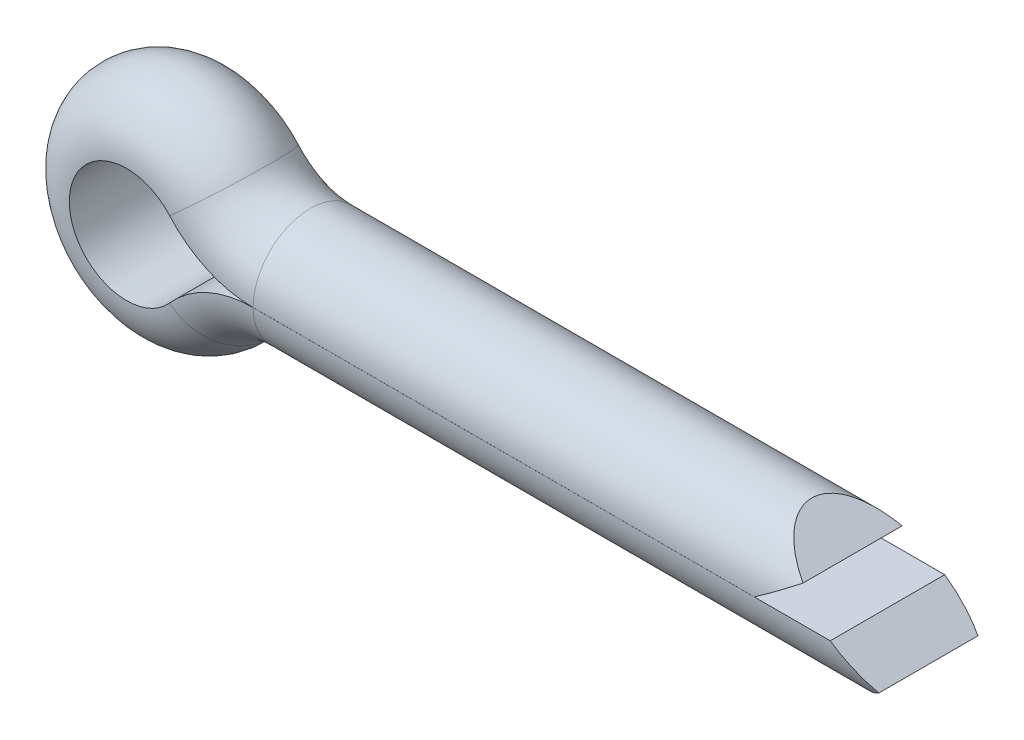
ISO-10303-21;
HEADER;
FILE_DESCRIPTION(('STEP AP214'),'2;1');
FILE_NAME('part.step','',(''),(''),'','','');
FILE_SCHEMA(('AUTOMOTIVE_DESIGN { 1 0 10303 214 1 1 1 1 }'));
ENDSEC;
DATA;
#1=APPLICATION_CONTEXT('core data for automotive mechanical design processes');
#2=APPLICATION_PROTOCOL_DEFINITION('international standard','automotive_design',2000,#1);
#3=PRODUCT_CONTEXT('',#1,'mechanical');
#4=PRODUCT('Part','Part','',(#3));
#5=PRODUCT_RELATED_PRODUCT_CATEGORY('part','',(#4));
#6=PRODUCT_DEFINITION_FORMATION('','',#4);
#7=PRODUCT_DEFINITION_CONTEXT('part definition',#1,'design');
#8=PRODUCT_DEFINITION('design','',#6,#7);
#9=PRODUCT_DEFINITION_SHAPE('','',#8);
#10=(LENGTH_UNIT() NAMED_UNIT(*) SI_UNIT(.MILLI.,.METRE.));
#11=(NAMED_UNIT(*) PLANE_ANGLE_UNIT() SI_UNIT($,.RADIAN.));
#12=(NAMED_UNIT(*) SI_UNIT($,.STERADIAN.) SOLID_ANGLE_UNIT());
#13=UNCERTAINTY_MEASURE_WITH_UNIT(LENGTH_MEASURE(1.E-05),#10,'distance_accuracy_value','');
#14=(GEOMETRIC_REPRESENTATION_CONTEXT(3) GLOBAL_UNCERTAINTY_ASSIGNED_CONTEXT((#13)) GLOBAL_UNIT_ASSIGNED_CONTEXT((#10,
#11,#12)) REPRESENTATION_CONTEXT('',''));
#15=CARTESIAN_POINT('',(0.,0.,0.));
#16=DIRECTION('',(0.,0.,1.));
#17=DIRECTION('',(1.,0.,0.));
#18=AXIS2_PLACEMENT_3D('',#15,#16,#17);
#19=CARTESIAN_POINT('',(0.,-0.00199999999999983,4.74999957894735));
#20=DIRECTION('',(0.,-1.,0.));
#21=DIRECTION('',(0.,0.,-1.));
#22=AXIS2_PLACEMENT_3D('',#19,#20,#21);
#23=PLANE('',#22);
#24=DIRECTION('',(1.,0.,0.));
#25=VECTOR('',#24,1.);
#26=CARTESIAN_POINT('',(0.,-0.00199999999999983,4.74999957894735));
#27=LINE('',#26,#25);
#28=CARTESIAN_POINT('',(0.,-0.00199999999999983,4.74999957894735));
#29=VERTEX_POINT('',#28);
#30=CARTESIAN_POINT('',(47.9010703759948,-0.00199999999999983,4.74999957894735));
#31=VERTEX_POINT('',#30);
#32=EDGE_CURVE('E39',#29,#31,#27,.T.);
#33=ORIENTED_EDGE('',*,*,#32,.T.);
#34=DIRECTION('',(0.,0.,-1.));
#35=VECTOR('',#34,1.);
#36=CARTESIAN_POINT('',(47.9010703759948,-0.00199999999999983,4.74999957894735));
#37=LINE('',#36,#35);
#38=CARTESIAN_POINT('',(47.9010703759948,-0.00199999999999983,-4.74999957894735));
#39=VERTEX_POINT('',#38);
#40=EDGE_CURVE('E95',#31,#39,#37,.T.);
#41=ORIENTED_EDGE('',*,*,#40,.T.);
#42=DIRECTION('',(1.,0.,0.));
#43=VECTOR('',#42,1.);
#44=CARTESIAN_POINT('',(0.,-0.00199999999999983,-4.74999957894735));
#45=LINE('',#44,#43);
#46=CARTESIAN_POINT('',(0.,-0.00199999999999983,-4.74999957894735));
#47=VERTEX_POINT('',#46);
#48=EDGE_CURVE('E11',#47,#39,#45,.T.);
#49=ORIENTED_EDGE('',*,*,#48,.F.);
#50=DIRECTION('',(0.,0.,-1.));
#51=VECTOR('',#50,1.);
#52=CARTESIAN_POINT('',(0.,-0.00199999999999983,4.74999957894735));
#53=LINE('',#52,#51);
#54=EDGE_CURVE('E112',#29,#47,#53,.T.);
#55=ORIENTED_EDGE('',*,*,#54,.F.);
#56=EDGE_LOOP('',(#33,#41,#49,#55));
#57=FACE_BOUND('',#56,.T.);
#58=ADVANCED_FACE('F32',(#57),#23,.F.);
#59=CARTESIAN_POINT('',(0.,0.,0.));
#60=DIRECTION('',(1.,0.,0.));
#61=DIRECTION('',(0.,0.,-1.));
#62=AXIS2_PLACEMENT_3D('',#59,#60,#61);
#63=CYLINDRICAL_SURFACE('',#62,4.75);
#64=CARTESIAN_POINT('',(54.6847948103704,0.,0.));
#65=DIRECTION('',(-0.574540032520499,0.818476481660496,0.));
#66=DIRECTION('',(0.818476481660496,0.574540032520499,0.));
#67=AXIS2_PLACEMENT_3D('',#64,#65,#66);
#68=ELLIPSE('',#67,8.26748308409741,4.75);
#69=CARTESIAN_POINT('',(51.3000000000001,-2.37599999999998,-4.11304315562092));
#70=VERTEX_POINT('',#69);
#71=CARTESIAN_POINT('',(51.3000000000001,-2.376,4.11304315562092));
#72=VERTEX_POINT('',#71);
#73=EDGE_CURVE('E109',#70,#72,#68,.T.);
#74=ORIENTED_EDGE('',*,*,#73,.T.);
#75=CARTESIAN_POINT('',(47.8982069138011,0.,0.));
#76=DIRECTION('',(-0.572612045834188,-0.819826472471819,0.));
#77=DIRECTION('',(0.819826472471819,-0.572612045834188,0.));
#78=AXIS2_PLACEMENT_3D('',#75,#76,#77);
#79=ELLIPSE('',#78,8.29531972747822,4.75);
#80=EDGE_CURVE('E98',#72,#31,#79,.T.);
#81=ORIENTED_EDGE('',*,*,#80,.T.);
#82=ORIENTED_EDGE('',*,*,#32,.F.);
#83=CARTESIAN_POINT('',(0.,0.,0.));
#84=DIRECTION('',(-1.,0.,0.));
#85=DIRECTION('',(0.,0.,-1.));
#86=AXIS2_PLACEMENT_3D('',#83,#84,#85);
#87=CIRCLE('',#86,4.75);
#88=EDGE_CURVE('E122',#47,#29,#87,.T.);
#89=ORIENTED_EDGE('',*,*,#88,.F.);
#90=ORIENTED_EDGE('',*,*,#48,.T.);
#91=EDGE_CURVE('E100',#39,#70,#79,.T.);
#92=ORIENTED_EDGE('',*,*,#91,.T.);
#93=EDGE_LOOP('',(#74,#81,#82,#89,#90,#92));
#94=FACE_BOUND('',#93,.T.);
#95=ADVANCED_FACE('F106',(#94),#63,.T.);
#96=CARTESIAN_POINT('',(0.,-9.23026315789474,0.));
#97=DIRECTION('',(0.,0.,-1.));
#98=DIRECTION('',(-1.,0.,0.));
#99=AXIS2_PLACEMENT_3D('',#96,#97,#98);
#100=CYLINDRICAL_SURFACE('',#99,9.22826315789474);
#101=DIRECTION('',(0.,0.,-1.));
#102=VECTOR('',#101,1.);
#103=CARTESIAN_POINT('',(-6.93096847058819,-3.13743811764701,4.74999957894735));
#104=LINE('',#103,#102);
#105=CARTESIAN_POINT('',(-6.93096847058819,-3.13743811764701,4.74999957894735));
#106=VERTEX_POINT('',#105);
#107=CARTESIAN_POINT('',(-6.93096847058819,-3.13743811764701,-4.74999957894735));
#108=VERTEX_POINT('',#107);
#109=EDGE_CURVE('E130',#106,#108,#104,.T.);
#110=ORIENTED_EDGE('',*,*,#109,.F.);
#111=CARTESIAN_POINT('',(0.,-9.23026315789474,4.74999957894735));
#112=DIRECTION('',(0.,0.,-1.));
#113=DIRECTION('',(-1.,0.,0.));
#114=AXIS2_PLACEMENT_3D('',#111,#112,#113);
#115=CIRCLE('',#114,9.22826315789474);
#116=EDGE_CURVE('E116',#106,#29,#115,.T.);
#117=ORIENTED_EDGE('',*,*,#116,.T.);
#118=ORIENTED_EDGE('',*,*,#54,.T.);
#119=CARTESIAN_POINT('',(0.,-9.23026315789474,-4.74999957894735));
#120=DIRECTION('',(0.,0.,-1.));
#121=DIRECTION('',(-1.,0.,0.));
#122=AXIS2_PLACEMENT_3D('',#119,#120,#121);
#123=CIRCLE('',#122,9.22826315789474);
#124=EDGE_CURVE('E114',#108,#47,#123,.T.);
#125=ORIENTED_EDGE('',*,*,#124,.F.);
#126=EDGE_LOOP('',(#110,#117,#118,#125));
#127=FACE_BOUND('',#126,.T.);
#128=ADVANCED_FACE('F195',(#127),#100,.T.);
#129=CARTESIAN_POINT('',(0.,-9.23026315789474,0.));
#130=DIRECTION('',(0.,0.,-1.));
#131=DIRECTION('',(-1.,0.,0.));
#132=AXIS2_PLACEMENT_3D('',#129,#130,#131);
#133=TOROIDAL_SURFACE('',#132,9.23026315789474,4.75);
#134=CARTESIAN_POINT('',(-6.93247058823525,-3.13611764705878,0.));
#135=DIRECTION('',(-0.660235294117636,-0.751058823529421,0.));
#136=DIRECTION('',(0.,0.,-1.));
#137=AXIS2_PLACEMENT_3D('',#134,#135,#136);
#138=CIRCLE('',#137,4.75);
#139=EDGE_CURVE('E133',#108,#106,#138,.T.);
#140=ORIENTED_EDGE('',*,*,#139,.F.);
#141=ORIENTED_EDGE('',*,*,#124,.T.);
#142=ORIENTED_EDGE('',*,*,#88,.T.);
#143=ORIENTED_EDGE('',*,*,#116,.F.);
#144=EDGE_LOOP('',(#140,#141,#142,#143));
#145=FACE_BOUND('',#144,.T.);
#146=ADVANCED_FACE('F197',(#145),#133,.T.);
#147=CARTESIAN_POINT('',(-10.5,0.,0.));
#148=DIRECTION('',(0.,0.,1.));
#149=DIRECTION('',(1.,0.,0.));
#150=AXIS2_PLACEMENT_3D('',#147,#148,#149);
#151=CYLINDRICAL_SURFACE('',#150,4.752);
#152=DIRECTION('',(0.,0.,-1.));
#153=VECTOR('',#152,1.);
#154=CARTESIAN_POINT('',(-6.93096847058824,3.13743811764706,4.74999957894735));
#155=LINE('',#154,#153);
#156=CARTESIAN_POINT('',(-6.93096847058824,3.13743811764706,4.74999957894735));
#157=VERTEX_POINT('',#156);
#158=CARTESIAN_POINT('',(-6.93096847058824,3.13743811764706,-4.74999957894735));
#159=VERTEX_POINT('',#158);
#160=EDGE_CURVE('E142',#157,#159,#155,.T.);
#161=ORIENTED_EDGE('',*,*,#160,.F.);
#162=CARTESIAN_POINT('',(-10.5,0.,4.74999957894735));
#163=DIRECTION('',(0.,0.,1.));
#164=DIRECTION('',(1.,0.,0.));
#165=AXIS2_PLACEMENT_3D('',#162,#163,#164);
#166=CIRCLE('',#165,4.752);
#167=EDGE_CURVE('E127',#157,#106,#166,.T.);
#168=ORIENTED_EDGE('',*,*,#167,.T.);
#169=ORIENTED_EDGE('',*,*,#109,.T.);
#170=CARTESIAN_POINT('',(-10.5,0.,-4.74999957894735));
#171=DIRECTION('',(0.,0.,1.));
#172=DIRECTION('',(1.,0.,0.));
#173=AXIS2_PLACEMENT_3D('',#170,#171,#172);
#174=CIRCLE('',#173,4.752);
#175=EDGE_CURVE('E124',#159,#108,#174,.T.);
#176=ORIENTED_EDGE('',*,*,#175,.F.);
#177=EDGE_LOOP('',(#161,#168,#169,#176));
#178=FACE_BOUND('',#177,.T.);
#179=ADVANCED_FACE('F192',(#178),#151,.F.);
#180=CARTESIAN_POINT('',(-10.5,0.,0.));
#181=DIRECTION('',(0.,0.,1.));
#182=DIRECTION('',(1.,0.,0.));
#183=AXIS2_PLACEMENT_3D('',#180,#181,#182);
#184=DEGENERATE_TOROIDAL_SURFACE('',#183,4.75,4.75,.T.);
#185=CARTESIAN_POINT('',(-6.93247058823529,3.13611764705882,0.));
#186=DIRECTION('',(0.660235294117647,-0.751058823529412,0.));
#187=DIRECTION('',(0.,0.,-1.));
#188=AXIS2_PLACEMENT_3D('',#185,#186,#187);
#189=CIRCLE('',#188,4.75);
#190=EDGE_CURVE('E145',#159,#157,#189,.T.);
#191=ORIENTED_EDGE('',*,*,#190,.F.);
#192=ORIENTED_EDGE('',*,*,#175,.T.);
#193=ORIENTED_EDGE('',*,*,#139,.T.);
#194=ORIENTED_EDGE('',*,*,#167,.F.);
#195=EDGE_LOOP('',(#191,#192,#193,#194));
#196=FACE_BOUND('',#195,.T.);
#197=ADVANCED_FACE('F189',(#196),#184,.T.);
#198=CARTESIAN_POINT('',(0.,9.23026315789474,0.));
#199=DIRECTION('',(0.,0.,-1.));
#200=DIRECTION('',(-1.,0.,0.));
#201=AXIS2_PLACEMENT_3D('',#198,#199,#200);
#202=CYLINDRICAL_SURFACE('',#201,9.22826315789474);
#203=DIRECTION('',(0.,0.,-1.));
#204=VECTOR('',#203,1.);
#205=CARTESIAN_POINT('',(0.,0.002,4.74999957894735));
#206=LINE('',#205,#204);
#207=CARTESIAN_POINT('',(0.,0.002,4.74999957894735));
#208=VERTEX_POINT('',#207);
#209=CARTESIAN_POINT('',(0.,0.002,-4.74999957894735));
#210=VERTEX_POINT('',#209);
#211=EDGE_CURVE('E152',#208,#210,#206,.T.);
#212=ORIENTED_EDGE('',*,*,#211,.F.);
#213=CARTESIAN_POINT('',(0.,9.23026315789474,4.74999957894735));
#214=DIRECTION('',(0.,0.,-1.));
#215=DIRECTION('',(-1.,0.,0.));
#216=AXIS2_PLACEMENT_3D('',#213,#214,#215);
#217=CIRCLE('',#216,9.22826315789474);
#218=EDGE_CURVE('E139',#208,#157,#217,.T.);
#219=ORIENTED_EDGE('',*,*,#218,.T.);
#220=ORIENTED_EDGE('',*,*,#160,.T.);
#221=CARTESIAN_POINT('',(0.,9.23026315789474,-4.74999957894735));
#222=DIRECTION('',(0.,0.,-1.));
#223=DIRECTION('',(-1.,0.,0.));
#224=AXIS2_PLACEMENT_3D('',#221,#222,#223);
#225=CIRCLE('',#224,9.22826315789474);
#226=EDGE_CURVE('E136',#210,#159,#225,.T.);
#227=ORIENTED_EDGE('',*,*,#226,.F.);
#228=EDGE_LOOP('',(#212,#219,#220,#227));
#229=FACE_BOUND('',#228,.T.);
#230=ADVANCED_FACE('F183',(#229),#202,.T.);
#231=CARTESIAN_POINT('',(0.,9.23026315789474,0.));
#232=DIRECTION('',(0.,0.,-1.));
#233=DIRECTION('',(-1.,0.,0.));
#234=AXIS2_PLACEMENT_3D('',#231,#232,#233);
#235=TOROIDAL_SURFACE('',#234,9.23026315789474,4.75);
#236=CARTESIAN_POINT('',(0.,0.,0.));
#237=DIRECTION('',(1.,0.,0.));
#238=DIRECTION('',(0.,0.,-1.));
#239=AXIS2_PLACEMENT_3D('',#236,#237,#238);
#240=CIRCLE('',#239,4.75);
#241=EDGE_CURVE('E157',#210,#208,#240,.T.);
#242=ORIENTED_EDGE('',*,*,#241,.F.);
#243=ORIENTED_EDGE('',*,*,#226,.T.);
#244=ORIENTED_EDGE('',*,*,#190,.T.);
#245=ORIENTED_EDGE('',*,*,#218,.F.);
#246=EDGE_LOOP('',(#242,#243,#244,#245));
#247=FACE_BOUND('',#246,.T.);
#248=ADVANCED_FACE('F186',(#247),#235,.T.);
#249=CARTESIAN_POINT('',(0.,0.,0.));
#250=DIRECTION('',(1.,0.,0.));
#251=DIRECTION('',(0.,0.,-1.));
#252=AXIS2_PLACEMENT_3D('',#249,#250,#251);
#253=CYLINDRICAL_SURFACE('',#252,4.75);
#254=CARTESIAN_POINT('',(41.598206913801,0.,0.));
#255=DIRECTION('',(-0.572612045834189,0.819826472471818,0.));
#256=DIRECTION('',(0.819826472471818,0.572612045834189,0.));
#257=AXIS2_PLACEMENT_3D('',#254,#255,#256);
#258=ELLIPSE('',#257,8.2953197274782,4.75);
#259=CARTESIAN_POINT('',(45.,2.376,4.11304315562091));
#260=VERTEX_POINT('',#259);
#261=CARTESIAN_POINT('',(41.6010703759947,0.002,4.74999957894735));
#262=VERTEX_POINT('',#261);
#263=EDGE_CURVE('E46',#260,#262,#258,.F.);
#264=ORIENTED_EDGE('',*,*,#263,.F.);
#265=CARTESIAN_POINT('',(48.3847948103702,0.,0.));
#266=DIRECTION('',(-0.574540032520499,-0.818476481660495,0.));
#267=DIRECTION('',(0.818476481660496,-0.574540032520499,0.));
#268=AXIS2_PLACEMENT_3D('',#265,#266,#267);
#269=ELLIPSE('',#268,8.2674830840974,4.75);
#270=CARTESIAN_POINT('',(45.,2.376,-4.11304315562091));
#271=VERTEX_POINT('',#270);
#272=EDGE_CURVE('E165',#271,#260,#269,.F.);
#273=ORIENTED_EDGE('',*,*,#272,.F.);
#274=CARTESIAN_POINT('',(41.6010703759947,0.00200000000000035,-4.74999957894735));
#275=VERTEX_POINT('',#274);
#276=EDGE_CURVE('E161',#275,#271,#258,.F.);
#277=ORIENTED_EDGE('',*,*,#276,.F.);
#278=DIRECTION('',(1.,0.,0.));
#279=VECTOR('',#278,1.);
#280=CARTESIAN_POINT('',(0.,0.002,-4.74999957894735));
#281=LINE('',#280,#279);
#282=EDGE_CURVE('E148',#210,#275,#281,.T.);
#283=ORIENTED_EDGE('',*,*,#282,.F.);
#284=ORIENTED_EDGE('',*,*,#241,.T.);
#285=DIRECTION('',(1.,0.,0.));
#286=VECTOR('',#285,1.);
#287=CARTESIAN_POINT('',(0.,0.002,4.74999957894735));
#288=LINE('',#287,#286);
#289=EDGE_CURVE('E149',#208,#262,#288,.T.);
#290=ORIENTED_EDGE('',*,*,#289,.T.);
#291=EDGE_LOOP('',(#264,#273,#277,#283,#284,#290));
#292=FACE_BOUND('',#291,.T.);
#293=ADVANCED_FACE('F175',(#292),#253,.T.);
#294=CARTESIAN_POINT('',(0.,0.002,4.74999957894735));
#295=DIRECTION('',(0.,-1.,0.));
#296=DIRECTION('',(0.,0.,-1.));
#297=AXIS2_PLACEMENT_3D('',#294,#295,#296);
#298=PLANE('',#297);
#299=DIRECTION('',(0.,0.,-1.));
#300=VECTOR('',#299,1.);
#301=CARTESIAN_POINT('',(41.6010703759947,0.002,4.74999957894735));
#302=LINE('',#301,#300);
#303=EDGE_CURVE('E163',#262,#275,#302,.T.);
#304=ORIENTED_EDGE('',*,*,#303,.F.);
#305=ORIENTED_EDGE('',*,*,#289,.F.);
#306=ORIENTED_EDGE('',*,*,#211,.T.);
#307=ORIENTED_EDGE('',*,*,#282,.T.);
#308=EDGE_LOOP('',(#304,#305,#306,#307));
#309=FACE_BOUND('',#308,.T.);
#310=ADVANCED_FACE('F180',(#309),#298,.T.);
#311=CARTESIAN_POINT('',(45.,2.376,-4.74999957894735));
#312=DIRECTION('',(-0.572612045834189,0.819826472471818,0.));
#313=DIRECTION('',(-0.819826472471818,-0.572612045834189,0.));
#314=AXIS2_PLACEMENT_3D('',#311,#312,#313);
#315=PLANE('',#314);
#316=ORIENTED_EDGE('',*,*,#263,.T.);
#317=ORIENTED_EDGE('',*,*,#303,.T.);
#318=ORIENTED_EDGE('',*,*,#276,.T.);
#319=DIRECTION('',(0.,0.,1.));
#320=VECTOR('',#319,1.);
#321=CARTESIAN_POINT('',(45.,2.376,-4.74999957894735));
#322=LINE('',#321,#320);
#323=EDGE_CURVE('E167',#271,#260,#322,.T.);
#324=ORIENTED_EDGE('',*,*,#323,.T.);
#325=EDGE_LOOP('',(#316,#317,#318,#324));
#326=FACE_BOUND('',#325,.T.);
#327=ADVANCED_FACE('F170',(#326),#315,.F.);
#328=CARTESIAN_POINT('',(45.,2.376,-4.74999957894735));
#329=DIRECTION('',(-0.574540032520499,-0.818476481660495,0.));
#330=DIRECTION('',(0.818476481660495,-0.574540032520499,0.));
#331=AXIS2_PLACEMENT_3D('',#328,#329,#330);
#332=PLANE('',#331);
#333=ORIENTED_EDGE('',*,*,#272,.T.);
#334=ORIENTED_EDGE('',*,*,#323,.F.);
#335=EDGE_LOOP('',(#333,#334));
#336=FACE_BOUND('',#335,.T.);
#337=ADVANCED_FACE('F276',(#336),#332,.F.);
#338=CARTESIAN_POINT('',(51.3000000000001,-2.376,-4.74999957894735));
#339=DIRECTION('',(-0.574540032520499,0.818476481660496,0.));
#340=DIRECTION('',(-0.818476481660496,-0.574540032520499,0.));
#341=AXIS2_PLACEMENT_3D('',#338,#339,#340);
#342=PLANE('',#341);
#343=DIRECTION('',(0.,0.,1.));
#344=VECTOR('',#343,1.);
#345=CARTESIAN_POINT('',(51.3000000000001,-2.376,-4.74999957894735));
#346=LINE('',#345,#344);
#347=EDGE_CURVE('E54',#70,#72,#346,.T.);
#348=ORIENTED_EDGE('',*,*,#347,.T.);
#349=ORIENTED_EDGE('',*,*,#73,.F.);
#350=EDGE_LOOP('',(#348,#349));
#351=FACE_BOUND('',#350,.T.);
#352=ADVANCED_FACE('F283',(#351),#342,.F.);
#353=CARTESIAN_POINT('',(51.3000000000001,-2.376,-4.74999957894735));
#354=DIRECTION('',(-0.572612045834188,-0.819826472471819,0.));
#355=DIRECTION('',(0.819826472471819,-0.572612045834188,0.));
#356=AXIS2_PLACEMENT_3D('',#353,#354,#355);
#357=PLANE('',#356);
#358=ORIENTED_EDGE('',*,*,#347,.F.);
#359=ORIENTED_EDGE('',*,*,#91,.F.);
#360=ORIENTED_EDGE('',*,*,#40,.F.);
#361=ORIENTED_EDGE('',*,*,#80,.F.);
#362=EDGE_LOOP('',(#358,#359,#360,#361));
#363=FACE_BOUND('',#362,.T.);
#364=ADVANCED_FACE('F97',(#363),#357,.F.);
#365=CLOSED_SHELL('',(#58,#95,#128,#146,#179,#197,#230,#248,#293,#310,#327,#337,#352,#364));
#366=MANIFOLD_SOLID_BREP('B2',#365);
#367=ADVANCED_BREP_SHAPE_REPRESENTATION('',(#18,#366),#14);
#368=SHAPE_DEFINITION_REPRESENTATION(#9,#367);
ENDSEC;
END-ISO-10303-21;
